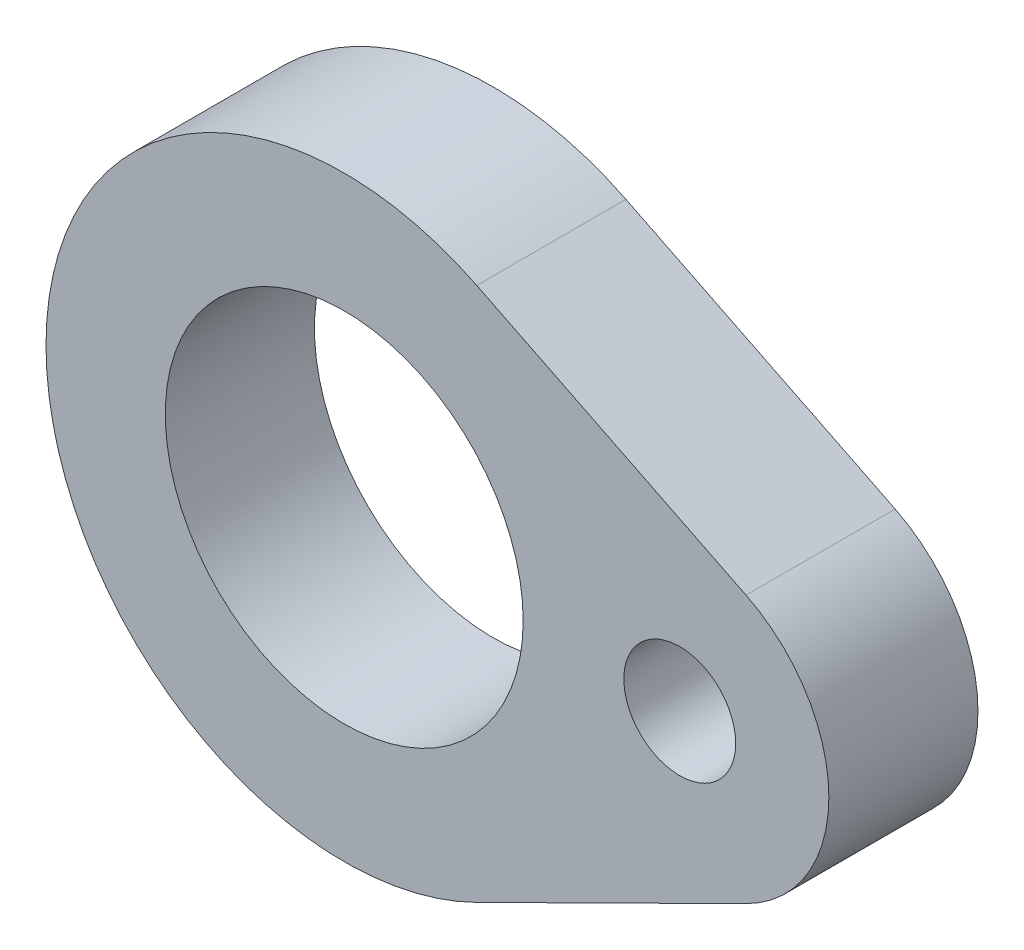
ISO-10303-21;
HEADER;
FILE_DESCRIPTION(('STEP AP214'),'2;1');
FILE_NAME('part.step','',(''),(''),'','','');
FILE_SCHEMA(('AUTOMOTIVE_DESIGN { 1 0 10303 214 1 1 1 1 }'));
ENDSEC;
DATA;
#1=APPLICATION_CONTEXT('core data for automotive mechanical design processes');
#2=APPLICATION_PROTOCOL_DEFINITION('international standard','automotive_design',2000,#1);
#3=PRODUCT_CONTEXT('',#1,'mechanical');
#4=PRODUCT('Part','Part','',(#3));
#5=PRODUCT_RELATED_PRODUCT_CATEGORY('part','',(#4));
#6=PRODUCT_DEFINITION_FORMATION('','',#4);
#7=PRODUCT_DEFINITION_CONTEXT('part definition',#1,'design');
#8=PRODUCT_DEFINITION('design','',#6,#7);
#9=PRODUCT_DEFINITION_SHAPE('','',#8);
#10=(LENGTH_UNIT() NAMED_UNIT(*) SI_UNIT(.MILLI.,.METRE.));
#11=(NAMED_UNIT(*) PLANE_ANGLE_UNIT() SI_UNIT($,.RADIAN.));
#12=(NAMED_UNIT(*) SI_UNIT($,.STERADIAN.) SOLID_ANGLE_UNIT());
#13=UNCERTAINTY_MEASURE_WITH_UNIT(LENGTH_MEASURE(1.E-05),#10,'distance_accuracy_value','');
#14=(GEOMETRIC_REPRESENTATION_CONTEXT(3) GLOBAL_UNCERTAINTY_ASSIGNED_CONTEXT((#13)) GLOBAL_UNIT_ASSIGNED_CONTEXT((#10,
#11,#12)) REPRESENTATION_CONTEXT('',''));
#15=CARTESIAN_POINT('',(0.,0.,0.));
#16=DIRECTION('',(0.,0.,1.));
#17=DIRECTION('',(1.,0.,0.));
#18=AXIS2_PLACEMENT_3D('',#15,#16,#17);
#19=CARTESIAN_POINT('',(0.,0.,1.));
#20=DIRECTION('',(0.,0.,1.));
#21=DIRECTION('',(1.,0.,0.));
#22=AXIS2_PLACEMENT_3D('',#19,#20,#21);
#23=PLANE('',#22);
#24=CARTESIAN_POINT('',(0.,0.,1.));
#25=DIRECTION('',(0.,0.,1.));
#26=DIRECTION('',(1.,0.,0.));
#27=AXIS2_PLACEMENT_3D('',#24,#25,#26);
#28=CIRCLE('',#27,2.4);
#29=CARTESIAN_POINT('',(2.4,0.,1.));
#30=VERTEX_POINT('',#29);
#31=EDGE_CURVE('E112',#30,#30,#28,.T.);
#32=ORIENTED_EDGE('',*,*,#31,.F.);
#33=EDGE_LOOP('',(#32));
#34=FACE_BOUND('',#33,.T.);
#35=CARTESIAN_POINT('',(0.,0.,1.));
#36=DIRECTION('',(0.,0.,1.));
#37=DIRECTION('',(1.,0.,0.));
#38=AXIS2_PLACEMENT_3D('',#35,#36,#37);
#39=CIRCLE('',#38,4.);
#40=CARTESIAN_POINT('',(1.77777777777778,3.58322566591047,1.));
#41=VERTEX_POINT('',#40);
#42=CARTESIAN_POINT('',(1.77777777777778,-3.58322566591047,1.));
#43=VERTEX_POINT('',#42);
#44=EDGE_CURVE('E92',#41,#43,#39,.T.);
#45=ORIENTED_EDGE('',*,*,#44,.T.);
#46=DIRECTION('',(0.895806416477617,0.444444444444445,0.));
#47=VECTOR('',#46,1.);
#48=CARTESIAN_POINT('',(5.38888888888889,-1.79161283295523,1.));
#49=LINE('',#48,#47);
#50=CARTESIAN_POINT('',(5.38888888888889,-1.79161283295523,1.));
#51=VERTEX_POINT('',#50);
#52=EDGE_CURVE('E87',#43,#51,#49,.T.);
#53=ORIENTED_EDGE('',*,*,#52,.T.);
#54=CARTESIAN_POINT('',(4.5,0.,1.));
#55=DIRECTION('',(0.,0.,1.));
#56=DIRECTION('',(-1.,0.,0.));
#57=AXIS2_PLACEMENT_3D('',#54,#55,#56);
#58=CIRCLE('',#57,2.);
#59=CARTESIAN_POINT('',(5.38888888888889,1.79161283295523,1.));
#60=VERTEX_POINT('',#59);
#61=EDGE_CURVE('E90',#51,#60,#58,.T.);
#62=ORIENTED_EDGE('',*,*,#61,.T.);
#63=DIRECTION('',(-0.895806416477617,0.444444444444445,0.));
#64=VECTOR('',#63,1.);
#65=CARTESIAN_POINT('',(1.77777777777778,3.58322566591047,1.));
#66=LINE('',#65,#64);
#67=EDGE_CURVE('E57',#60,#41,#66,.T.);
#68=ORIENTED_EDGE('',*,*,#67,.T.);
#69=EDGE_LOOP('',(#45,#53,#62,#68));
#70=FACE_BOUND('',#69,.T.);
#71=CARTESIAN_POINT('',(4.5,0.,1.));
#72=DIRECTION('',(0.,0.,1.));
#73=DIRECTION('',(1.,0.,0.));
#74=AXIS2_PLACEMENT_3D('',#71,#72,#73);
#75=CIRCLE('',#74,0.750000000000001);
#76=CARTESIAN_POINT('',(5.25,0.,1.));
#77=VERTEX_POINT('',#76);
#78=EDGE_CURVE('E134',#77,#77,#75,.T.);
#79=ORIENTED_EDGE('',*,*,#78,.F.);
#80=EDGE_LOOP('',(#79));
#81=FACE_BOUND('',#80,.T.);
#82=ADVANCED_FACE('F39',(#34,#70,#81),#23,.T.);
#83=CARTESIAN_POINT('',(0.,0.,-1.));
#84=DIRECTION('',(0.,0.,1.));
#85=DIRECTION('',(1.,0.,0.));
#86=AXIS2_PLACEMENT_3D('',#83,#84,#85);
#87=PLANE('',#86);
#88=CARTESIAN_POINT('',(0.,0.,-1.));
#89=DIRECTION('',(0.,0.,1.));
#90=DIRECTION('',(1.,0.,0.));
#91=AXIS2_PLACEMENT_3D('',#88,#89,#90);
#92=CIRCLE('',#91,4.);
#93=CARTESIAN_POINT('',(1.77777777777778,3.58322566591047,-1.));
#94=VERTEX_POINT('',#93);
#95=CARTESIAN_POINT('',(1.77777777777778,-3.58322566591047,-1.));
#96=VERTEX_POINT('',#95);
#97=EDGE_CURVE('E108',#94,#96,#92,.T.);
#98=ORIENTED_EDGE('',*,*,#97,.F.);
#99=DIRECTION('',(-0.895806416477617,0.444444444444445,0.));
#100=VECTOR('',#99,1.);
#101=CARTESIAN_POINT('',(1.77777777777778,3.58322566591047,-1.));
#102=LINE('',#101,#100);
#103=CARTESIAN_POINT('',(5.38888888888889,1.79161283295523,-1.));
#104=VERTEX_POINT('',#103);
#105=EDGE_CURVE('E80',#104,#94,#102,.T.);
#106=ORIENTED_EDGE('',*,*,#105,.F.);
#107=CARTESIAN_POINT('',(4.5,0.,-1.));
#108=DIRECTION('',(0.,0.,1.));
#109=DIRECTION('',(-1.,0.,0.));
#110=AXIS2_PLACEMENT_3D('',#107,#108,#109);
#111=CIRCLE('',#110,2.);
#112=CARTESIAN_POINT('',(5.38888888888889,-1.79161283295523,-1.));
#113=VERTEX_POINT('',#112);
#114=EDGE_CURVE('E74',#113,#104,#111,.T.);
#115=ORIENTED_EDGE('',*,*,#114,.F.);
#116=DIRECTION('',(0.895806416477617,0.444444444444445,0.));
#117=VECTOR('',#116,1.);
#118=CARTESIAN_POINT('',(5.38888888888889,-1.79161283295523,-1.));
#119=LINE('',#118,#117);
#120=EDGE_CURVE('E97',#96,#113,#119,.T.);
#121=ORIENTED_EDGE('',*,*,#120,.F.);
#122=EDGE_LOOP('',(#98,#106,#115,#121));
#123=FACE_BOUND('',#122,.T.);
#124=CARTESIAN_POINT('',(0.,0.,-1.));
#125=DIRECTION('',(0.,0.,1.));
#126=DIRECTION('',(1.,0.,0.));
#127=AXIS2_PLACEMENT_3D('',#124,#125,#126);
#128=CIRCLE('',#127,2.4);
#129=CARTESIAN_POINT('',(2.4,0.,-1.));
#130=VERTEX_POINT('',#129);
#131=EDGE_CURVE('E130',#130,#130,#128,.T.);
#132=ORIENTED_EDGE('',*,*,#131,.T.);
#133=EDGE_LOOP('',(#132));
#134=FACE_BOUND('',#133,.T.);
#135=CARTESIAN_POINT('',(4.5,0.,-1.));
#136=DIRECTION('',(0.,0.,1.));
#137=DIRECTION('',(1.,0.,0.));
#138=AXIS2_PLACEMENT_3D('',#135,#136,#137);
#139=CIRCLE('',#138,0.750000000000001);
#140=CARTESIAN_POINT('',(5.25,0.,-1.));
#141=VERTEX_POINT('',#140);
#142=EDGE_CURVE('E138',#141,#141,#139,.T.);
#143=ORIENTED_EDGE('',*,*,#142,.T.);
#144=EDGE_LOOP('',(#143));
#145=FACE_BOUND('',#144,.T.);
#146=ADVANCED_FACE('F125',(#123,#134,#145),#87,.F.);
#147=CARTESIAN_POINT('',(0.,0.,1.));
#148=DIRECTION('',(0.,0.,-1.));
#149=DIRECTION('',(-1.,0.,0.));
#150=AXIS2_PLACEMENT_3D('',#147,#148,#149);
#151=CYLINDRICAL_SURFACE('',#150,4.);
#152=ORIENTED_EDGE('',*,*,#97,.T.);
#153=DIRECTION('',(0.,0.,-1.));
#154=VECTOR('',#153,1.);
#155=CARTESIAN_POINT('',(1.77777777777778,-3.58322566591047,1.));
#156=LINE('',#155,#154);
#157=EDGE_CURVE('E11',#43,#96,#156,.T.);
#158=ORIENTED_EDGE('',*,*,#157,.F.);
#159=ORIENTED_EDGE('',*,*,#44,.F.);
#160=DIRECTION('',(0.,0.,-1.));
#161=VECTOR('',#160,1.);
#162=CARTESIAN_POINT('',(1.77777777777778,3.58322566591047,1.));
#163=LINE('',#162,#161);
#164=EDGE_CURVE('E104',#41,#94,#163,.T.);
#165=ORIENTED_EDGE('',*,*,#164,.T.);
#166=EDGE_LOOP('',(#152,#158,#159,#165));
#167=FACE_BOUND('',#166,.T.);
#168=ADVANCED_FACE('F41',(#167),#151,.T.);
#169=CARTESIAN_POINT('',(5.38888888888889,-1.79161283295523,1.));
#170=DIRECTION('',(-0.444444444444445,0.895806416477617,0.));
#171=DIRECTION('',(-0.895806416477617,-0.444444444444445,0.));
#172=AXIS2_PLACEMENT_3D('',#169,#170,#171);
#173=PLANE('',#172);
#174=ORIENTED_EDGE('',*,*,#120,.T.);
#175=DIRECTION('',(0.,0.,-1.));
#176=VECTOR('',#175,1.);
#177=CARTESIAN_POINT('',(5.38888888888889,-1.79161283295523,1.));
#178=LINE('',#177,#176);
#179=EDGE_CURVE('E49',#51,#113,#178,.T.);
#180=ORIENTED_EDGE('',*,*,#179,.F.);
#181=ORIENTED_EDGE('',*,*,#52,.F.);
#182=ORIENTED_EDGE('',*,*,#157,.T.);
#183=EDGE_LOOP('',(#174,#180,#181,#182));
#184=FACE_BOUND('',#183,.T.);
#185=ADVANCED_FACE('F96',(#184),#173,.F.);
#186=CARTESIAN_POINT('',(4.5,0.,1.));
#187=DIRECTION('',(0.,0.,-1.));
#188=DIRECTION('',(-1.,0.,0.));
#189=AXIS2_PLACEMENT_3D('',#186,#187,#188);
#190=CYLINDRICAL_SURFACE('',#189,2.);
#191=ORIENTED_EDGE('',*,*,#114,.T.);
#192=DIRECTION('',(0.,0.,-1.));
#193=VECTOR('',#192,1.);
#194=CARTESIAN_POINT('',(5.38888888888889,1.79161283295523,1.));
#195=LINE('',#194,#193);
#196=EDGE_CURVE('E99',#60,#104,#195,.T.);
#197=ORIENTED_EDGE('',*,*,#196,.F.);
#198=ORIENTED_EDGE('',*,*,#61,.F.);
#199=ORIENTED_EDGE('',*,*,#179,.T.);
#200=EDGE_LOOP('',(#191,#197,#198,#199));
#201=FACE_BOUND('',#200,.T.);
#202=ADVANCED_FACE('F100',(#201),#190,.T.);
#203=CARTESIAN_POINT('',(1.77777777777778,3.58322566591047,1.));
#204=DIRECTION('',(-0.444444444444445,-0.895806416477617,0.));
#205=DIRECTION('',(0.895806416477617,-0.444444444444445,0.));
#206=AXIS2_PLACEMENT_3D('',#203,#204,#205);
#207=PLANE('',#206);
#208=ORIENTED_EDGE('',*,*,#105,.T.);
#209=ORIENTED_EDGE('',*,*,#164,.F.);
#210=ORIENTED_EDGE('',*,*,#67,.F.);
#211=ORIENTED_EDGE('',*,*,#196,.T.);
#212=EDGE_LOOP('',(#208,#209,#210,#211));
#213=FACE_BOUND('',#212,.T.);
#214=ADVANCED_FACE('F122',(#213),#207,.F.);
#215=CARTESIAN_POINT('',(0.,0.,1.));
#216=DIRECTION('',(0.,0.,-1.));
#217=DIRECTION('',(-1.,0.,0.));
#218=AXIS2_PLACEMENT_3D('',#215,#216,#217);
#219=CYLINDRICAL_SURFACE('',#218,2.4);
#220=ORIENTED_EDGE('',*,*,#31,.T.);
#221=EDGE_LOOP('',(#220));
#222=FACE_BOUND('',#221,.T.);
#223=ORIENTED_EDGE('',*,*,#131,.F.);
#224=EDGE_LOOP('',(#223));
#225=FACE_BOUND('',#224,.T.);
#226=ADVANCED_FACE('F157',(#222,#225),#219,.F.);
#227=CARTESIAN_POINT('',(4.5,0.,1.));
#228=DIRECTION('',(0.,0.,-1.));
#229=DIRECTION('',(-1.,0.,0.));
#230=AXIS2_PLACEMENT_3D('',#227,#228,#229);
#231=CYLINDRICAL_SURFACE('',#230,0.750000000000001);
#232=ORIENTED_EDGE('',*,*,#78,.T.);
#233=EDGE_LOOP('',(#232));
#234=FACE_BOUND('',#233,.T.);
#235=ORIENTED_EDGE('',*,*,#142,.F.);
#236=EDGE_LOOP('',(#235));
#237=FACE_BOUND('',#236,.T.);
#238=ADVANCED_FACE('F146',(#234,#237),#231,.F.);
#239=CLOSED_SHELL('',(#82,#146,#168,#185,#202,#214,#226,#238));
#240=MANIFOLD_SOLID_BREP('B2',#239);
#241=ADVANCED_BREP_SHAPE_REPRESENTATION('',(#18,#240),#14);
#242=SHAPE_DEFINITION_REPRESENTATION(#9,#241);
ENDSEC;
END-ISO-10303-21;
